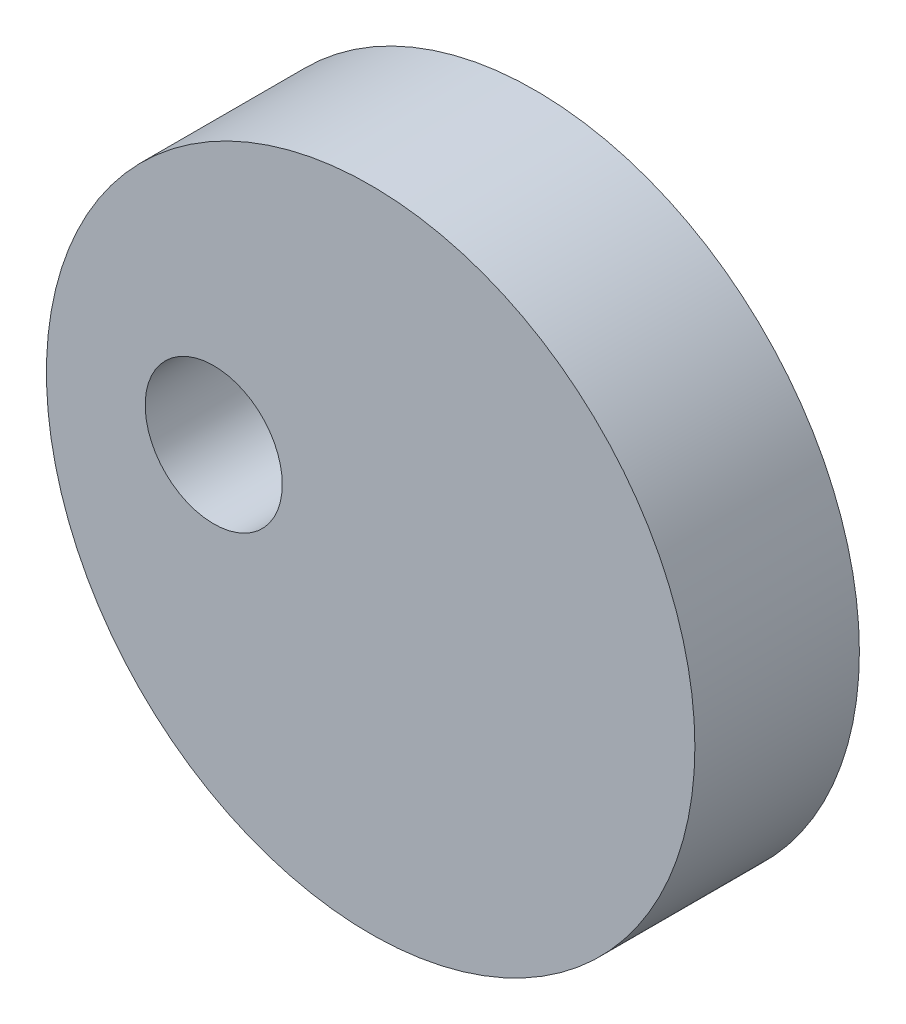
ISO-10303-21;
HEADER;
FILE_DESCRIPTION(('STEP AP214'),'2;1');
FILE_NAME('part.step','',(''),(''),'','','');
FILE_SCHEMA(('AUTOMOTIVE_DESIGN { 1 0 10303 214 1 1 1 1 }'));
ENDSEC;
DATA;
#1=APPLICATION_CONTEXT('core data for automotive mechanical design processes');
#2=APPLICATION_PROTOCOL_DEFINITION('international standard','automotive_design',2000,#1);
#3=PRODUCT_CONTEXT('',#1,'mechanical');
#4=PRODUCT('Part','Part','',(#3));
#5=PRODUCT_RELATED_PRODUCT_CATEGORY('part','',(#4));
#6=PRODUCT_DEFINITION_FORMATION('','',#4);
#7=PRODUCT_DEFINITION_CONTEXT('part definition',#1,'design');
#8=PRODUCT_DEFINITION('design','',#6,#7);
#9=PRODUCT_DEFINITION_SHAPE('','',#8);
#10=(LENGTH_UNIT() NAMED_UNIT(*) SI_UNIT(.MILLI.,.METRE.));
#11=(NAMED_UNIT(*) PLANE_ANGLE_UNIT() SI_UNIT($,.RADIAN.));
#12=(NAMED_UNIT(*) SI_UNIT($,.STERADIAN.) SOLID_ANGLE_UNIT());
#13=UNCERTAINTY_MEASURE_WITH_UNIT(LENGTH_MEASURE(1.E-05),#10,'distance_accuracy_value','');
#14=(GEOMETRIC_REPRESENTATION_CONTEXT(3) GLOBAL_UNCERTAINTY_ASSIGNED_CONTEXT((#13)) GLOBAL_UNIT_ASSIGNED_CONTEXT((#10,
#11,#12)) REPRESENTATION_CONTEXT('',''));
#15=CARTESIAN_POINT('',(0.,0.,0.));
#16=DIRECTION('',(0.,0.,1.));
#17=DIRECTION('',(1.,0.,0.));
#18=AXIS2_PLACEMENT_3D('',#15,#16,#17);
#19=CARTESIAN_POINT('',(0.,0.,30.));
#20=DIRECTION('',(0.,0.,-1.));
#21=DIRECTION('',(-1.,0.,0.));
#22=AXIS2_PLACEMENT_3D('',#19,#20,#21);
#23=CYLINDRICAL_SURFACE('',#22,59.1298387565203);
#24=CARTESIAN_POINT('',(0.,0.,30.));
#25=DIRECTION('',(0.,0.,1.));
#26=DIRECTION('',(1.,0.,0.));
#27=AXIS2_PLACEMENT_3D('',#24,#25,#26);
#28=CIRCLE('',#27,59.1298387565203);
#29=CARTESIAN_POINT('',(59.1298387565203,0.,30.));
#30=VERTEX_POINT('',#29);
#31=EDGE_CURVE('E10',#30,#30,#28,.T.);
#32=ORIENTED_EDGE('',*,*,#31,.F.);
#33=EDGE_LOOP('',(#32));
#34=FACE_BOUND('',#33,.T.);
#35=CARTESIAN_POINT('',(0.,0.,0.));
#36=DIRECTION('',(0.,0.,1.));
#37=DIRECTION('',(1.,0.,0.));
#38=AXIS2_PLACEMENT_3D('',#35,#36,#37);
#39=CIRCLE('',#38,59.1298387565203);
#40=CARTESIAN_POINT('',(59.1298387565203,0.,0.));
#41=VERTEX_POINT('',#40);
#42=EDGE_CURVE('E50',#41,#41,#39,.T.);
#43=ORIENTED_EDGE('',*,*,#42,.T.);
#44=EDGE_LOOP('',(#43));
#45=FACE_BOUND('',#44,.T.);
#46=ADVANCED_FACE('F47',(#34,#45),#23,.T.);
#47=CARTESIAN_POINT('',(0.,0.,30.));
#48=DIRECTION('',(0.,0.,1.));
#49=DIRECTION('',(1.,0.,0.));
#50=AXIS2_PLACEMENT_3D('',#47,#48,#49);
#51=PLANE('',#50);
#52=CARTESIAN_POINT('',(-28.6214571582813,3.81999527809742,30.));
#53=DIRECTION('',(0.,0.,1.));
#54=DIRECTION('',(1.,0.,0.));
#55=AXIS2_PLACEMENT_3D('',#52,#53,#54);
#56=CIRCLE('',#55,12.5);
#57=CARTESIAN_POINT('',(-16.1214571582814,3.81999527809742,30.));
#58=VERTEX_POINT('',#57);
#59=EDGE_CURVE('E64',#58,#58,#56,.T.);
#60=ORIENTED_EDGE('',*,*,#59,.F.);
#61=EDGE_LOOP('',(#60));
#62=FACE_BOUND('',#61,.T.);
#63=ORIENTED_EDGE('',*,*,#31,.T.);
#64=EDGE_LOOP('',(#63));
#65=FACE_BOUND('',#64,.T.);
#66=ADVANCED_FACE('F71',(#62,#65),#51,.T.);
#67=CARTESIAN_POINT('',(0.,0.,0.));
#68=DIRECTION('',(0.,0.,1.));
#69=DIRECTION('',(1.,0.,0.));
#70=AXIS2_PLACEMENT_3D('',#67,#68,#69);
#71=PLANE('',#70);
#72=CARTESIAN_POINT('',(-28.6214571582813,3.81999527809742,0.));
#73=DIRECTION('',(0.,0.,1.));
#74=DIRECTION('',(1.,0.,0.));
#75=AXIS2_PLACEMENT_3D('',#72,#73,#74);
#76=CIRCLE('',#75,12.5);
#77=CARTESIAN_POINT('',(-16.1214571582814,3.81999527809742,0.));
#78=VERTEX_POINT('',#77);
#79=EDGE_CURVE('E59',#78,#78,#76,.T.);
#80=ORIENTED_EDGE('',*,*,#79,.T.);
#81=EDGE_LOOP('',(#80));
#82=FACE_BOUND('',#81,.T.);
#83=ORIENTED_EDGE('',*,*,#42,.F.);
#84=EDGE_LOOP('',(#83));
#85=FACE_BOUND('',#84,.T.);
#86=ADVANCED_FACE('F73',(#82,#85),#71,.F.);
#87=CARTESIAN_POINT('',(-28.6214571582813,3.81999527809742,30.));
#88=DIRECTION('',(0.,0.,1.));
#89=DIRECTION('',(1.,0.,0.));
#90=AXIS2_PLACEMENT_3D('',#87,#88,#89);
#91=CYLINDRICAL_SURFACE('',#90,12.5);
#92=ORIENTED_EDGE('',*,*,#79,.F.);
#93=EDGE_LOOP('',(#92));
#94=FACE_BOUND('',#93,.T.);
#95=ORIENTED_EDGE('',*,*,#59,.T.);
#96=EDGE_LOOP('',(#95));
#97=FACE_BOUND('',#96,.T.);
#98=ADVANCED_FACE('F69',(#94,#97),#91,.F.);
#99=CLOSED_SHELL('',(#46,#66,#86,#98));
#100=MANIFOLD_SOLID_BREP('B2',#99);
#101=ADVANCED_BREP_SHAPE_REPRESENTATION('',(#18,#100),#14);
#102=SHAPE_DEFINITION_REPRESENTATION(#9,#101);
ENDSEC;
END-ISO-10303-21;
